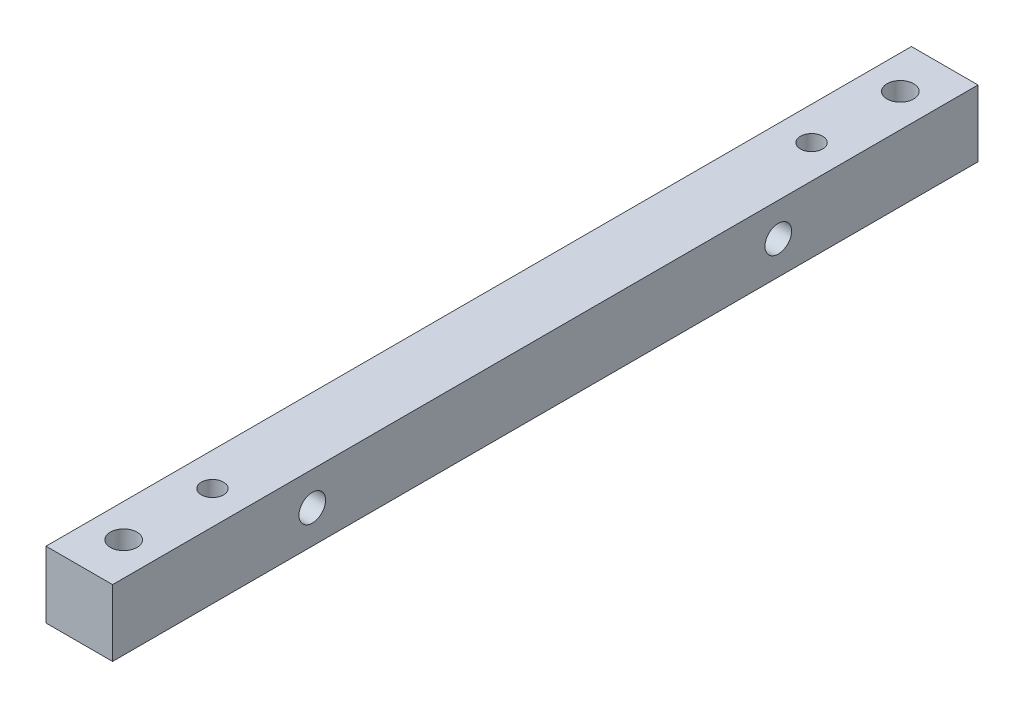
ISO-10303-21;
HEADER;
FILE_DESCRIPTION(('STEP AP214'),'2;1');
FILE_NAME('part.step','',(''),(''),'','','');
FILE_SCHEMA(('AUTOMOTIVE_DESIGN { 1 0 10303 214 1 1 1 1 }'));
ENDSEC;
DATA;
#1=APPLICATION_CONTEXT('core data for automotive mechanical design processes');
#2=APPLICATION_PROTOCOL_DEFINITION('international standard','automotive_design',2000,#1);
#3=PRODUCT_CONTEXT('',#1,'mechanical');
#4=PRODUCT('Part','Part','',(#3));
#5=PRODUCT_RELATED_PRODUCT_CATEGORY('part','',(#4));
#6=PRODUCT_DEFINITION_FORMATION('','',#4);
#7=PRODUCT_DEFINITION_CONTEXT('part definition',#1,'design');
#8=PRODUCT_DEFINITION('design','',#6,#7);
#9=PRODUCT_DEFINITION_SHAPE('','',#8);
#10=(LENGTH_UNIT() NAMED_UNIT(*) SI_UNIT(.MILLI.,.METRE.));
#11=(NAMED_UNIT(*) PLANE_ANGLE_UNIT() SI_UNIT($,.RADIAN.));
#12=(NAMED_UNIT(*) SI_UNIT($,.STERADIAN.) SOLID_ANGLE_UNIT());
#13=UNCERTAINTY_MEASURE_WITH_UNIT(LENGTH_MEASURE(1.E-05),#10,'distance_accuracy_value','');
#14=(GEOMETRIC_REPRESENTATION_CONTEXT(3) GLOBAL_UNCERTAINTY_ASSIGNED_CONTEXT((#13)) GLOBAL_UNIT_ASSIGNED_CONTEXT((#10,
#11,#12)) REPRESENTATION_CONTEXT('',''));
#15=CARTESIAN_POINT('',(0.,0.,0.));
#16=DIRECTION('',(0.,0.,1.));
#17=DIRECTION('',(1.,0.,0.));
#18=AXIS2_PLACEMENT_3D('',#15,#16,#17);
#19=CARTESIAN_POINT('',(0.,0.,78.));
#20=DIRECTION('',(1.,0.,0.));
#21=DIRECTION('',(0.,0.,-1.));
#22=AXIS2_PLACEMENT_3D('',#19,#20,#21);
#23=PLANE('',#22);
#24=CARTESIAN_POINT('',(0.,3.,60.));
#25=DIRECTION('',(1.,0.,0.));
#26=DIRECTION('',(0.,0.,-1.));
#27=AXIS2_PLACEMENT_3D('',#24,#25,#26);
#28=CIRCLE('',#27,1.2);
#29=CARTESIAN_POINT('',(0.,3.,58.8));
#30=VERTEX_POINT('',#29);
#31=EDGE_CURVE('E129',#30,#30,#28,.T.);
#32=ORIENTED_EDGE('',*,*,#31,.T.);
#33=EDGE_LOOP('',(#32));
#34=FACE_BOUND('',#33,.T.);
#35=CARTESIAN_POINT('',(0.,3.,18.));
#36=DIRECTION('',(1.,0.,0.));
#37=DIRECTION('',(0.,0.,-1.));
#38=AXIS2_PLACEMENT_3D('',#35,#36,#37);
#39=CIRCLE('',#38,1.2);
#40=CARTESIAN_POINT('',(0.,3.,16.8));
#41=VERTEX_POINT('',#40);
#42=EDGE_CURVE('E139',#41,#41,#39,.T.);
#43=ORIENTED_EDGE('',*,*,#42,.T.);
#44=EDGE_LOOP('',(#43));
#45=FACE_BOUND('',#44,.T.);
#46=DIRECTION('',(0.,-1.,0.));
#47=VECTOR('',#46,1.);
#48=CARTESIAN_POINT('',(0.,0.,0.));
#49=LINE('',#48,#47);
#50=CARTESIAN_POINT('',(0.,6.,0.));
#51=VERTEX_POINT('',#50);
#52=CARTESIAN_POINT('',(0.,0.,0.));
#53=VERTEX_POINT('',#52);
#54=EDGE_CURVE('E99',#51,#53,#49,.T.);
#55=ORIENTED_EDGE('',*,*,#54,.T.);
#56=DIRECTION('',(0.,0.,-1.));
#57=VECTOR('',#56,1.);
#58=CARTESIAN_POINT('',(0.,0.,78.));
#59=LINE('',#58,#57);
#60=CARTESIAN_POINT('',(0.,0.,78.));
#61=VERTEX_POINT('',#60);
#62=EDGE_CURVE('E11',#61,#53,#59,.T.);
#63=ORIENTED_EDGE('',*,*,#62,.F.);
#64=DIRECTION('',(0.,-1.,0.));
#65=VECTOR('',#64,1.);
#66=CARTESIAN_POINT('',(0.,0.,78.));
#67=LINE('',#66,#65);
#68=CARTESIAN_POINT('',(0.,6.,78.));
#69=VERTEX_POINT('',#68);
#70=EDGE_CURVE('E87',#69,#61,#67,.T.);
#71=ORIENTED_EDGE('',*,*,#70,.F.);
#72=DIRECTION('',(0.,0.,-1.));
#73=VECTOR('',#72,1.);
#74=CARTESIAN_POINT('',(0.,6.,78.));
#75=LINE('',#74,#73);
#76=EDGE_CURVE('E95',#69,#51,#75,.T.);
#77=ORIENTED_EDGE('',*,*,#76,.T.);
#78=EDGE_LOOP('',(#55,#63,#71,#77));
#79=FACE_BOUND('',#78,.T.);
#80=ADVANCED_FACE('F36',(#34,#45,#79),#23,.F.);
#81=CARTESIAN_POINT('',(0.,0.,78.));
#82=DIRECTION('',(0.,1.,0.));
#83=DIRECTION('',(0.,0.,1.));
#84=AXIS2_PLACEMENT_3D('',#81,#82,#83);
#85=PLANE('',#84);
#86=CARTESIAN_POINT('',(3.,0.,74.));
#87=DIRECTION('',(0.,1.,0.));
#88=DIRECTION('',(0.,0.,1.));
#89=AXIS2_PLACEMENT_3D('',#86,#87,#88);
#90=CIRCLE('',#89,1.2);
#91=CARTESIAN_POINT('',(3.,0.,75.2));
#92=VERTEX_POINT('',#91);
#93=EDGE_CURVE('E102',#92,#92,#90,.T.);
#94=ORIENTED_EDGE('',*,*,#93,.T.);
#95=EDGE_LOOP('',(#94));
#96=FACE_BOUND('',#95,.T.);
#97=CARTESIAN_POINT('',(3.,0.,4.));
#98=DIRECTION('',(0.,1.,0.));
#99=DIRECTION('',(0.,0.,1.));
#100=AXIS2_PLACEMENT_3D('',#97,#98,#99);
#101=CIRCLE('',#100,1.2);
#102=CARTESIAN_POINT('',(3.,0.,5.2));
#103=VERTEX_POINT('',#102);
#104=EDGE_CURVE('E115',#103,#103,#101,.T.);
#105=ORIENTED_EDGE('',*,*,#104,.T.);
#106=EDGE_LOOP('',(#105));
#107=FACE_BOUND('',#106,.T.);
#108=CARTESIAN_POINT('',(3.,0.,12.));
#109=DIRECTION('',(0.,1.,0.));
#110=DIRECTION('',(0.,0.,1.));
#111=AXIS2_PLACEMENT_3D('',#108,#109,#110);
#112=CIRCLE('',#111,1.);
#113=CARTESIAN_POINT('',(3.,0.,13.));
#114=VERTEX_POINT('',#113);
#115=EDGE_CURVE('E118',#114,#114,#112,.T.);
#116=ORIENTED_EDGE('',*,*,#115,.T.);
#117=EDGE_LOOP('',(#116));
#118=FACE_BOUND('',#117,.T.);
#119=CARTESIAN_POINT('',(3.,0.,66.));
#120=DIRECTION('',(0.,1.,0.));
#121=DIRECTION('',(0.,0.,1.));
#122=AXIS2_PLACEMENT_3D('',#119,#120,#121);
#123=CIRCLE('',#122,1.);
#124=CARTESIAN_POINT('',(3.,0.,67.));
#125=VERTEX_POINT('',#124);
#126=EDGE_CURVE('E121',#125,#125,#123,.T.);
#127=ORIENTED_EDGE('',*,*,#126,.T.);
#128=EDGE_LOOP('',(#127));
#129=FACE_BOUND('',#128,.T.);
#130=DIRECTION('',(1.,0.,0.));
#131=VECTOR('',#130,1.);
#132=CARTESIAN_POINT('',(0.,0.,0.));
#133=LINE('',#132,#131);
#134=CARTESIAN_POINT('',(6.,0.,0.));
#135=VERTEX_POINT('',#134);
#136=EDGE_CURVE('E91',#53,#135,#133,.T.);
#137=ORIENTED_EDGE('',*,*,#136,.T.);
#138=DIRECTION('',(0.,0.,-1.));
#139=VECTOR('',#138,1.);
#140=CARTESIAN_POINT('',(6.,0.,78.));
#141=LINE('',#140,#139);
#142=CARTESIAN_POINT('',(6.,0.,78.));
#143=VERTEX_POINT('',#142);
#144=EDGE_CURVE('E44',#143,#135,#141,.T.);
#145=ORIENTED_EDGE('',*,*,#144,.F.);
#146=DIRECTION('',(1.,0.,0.));
#147=VECTOR('',#146,1.);
#148=CARTESIAN_POINT('',(0.,0.,78.));
#149=LINE('',#148,#147);
#150=EDGE_CURVE('E82',#61,#143,#149,.T.);
#151=ORIENTED_EDGE('',*,*,#150,.F.);
#152=ORIENTED_EDGE('',*,*,#62,.T.);
#153=EDGE_LOOP('',(#137,#145,#151,#152));
#154=FACE_BOUND('',#153,.T.);
#155=ADVANCED_FACE('F90',(#96,#107,#118,#129,#154),#85,.F.);
#156=CARTESIAN_POINT('',(6.,0.,78.));
#157=DIRECTION('',(-1.,0.,0.));
#158=DIRECTION('',(0.,0.,1.));
#159=AXIS2_PLACEMENT_3D('',#156,#157,#158);
#160=PLANE('',#159);
#161=CARTESIAN_POINT('',(6.,3.,60.));
#162=DIRECTION('',(1.,0.,0.));
#163=DIRECTION('',(0.,0.,-1.));
#164=AXIS2_PLACEMENT_3D('',#161,#162,#163);
#165=CIRCLE('',#164,1.2);
#166=CARTESIAN_POINT('',(6.,3.,58.8));
#167=VERTEX_POINT('',#166);
#168=EDGE_CURVE('E142',#167,#167,#165,.T.);
#169=ORIENTED_EDGE('',*,*,#168,.F.);
#170=EDGE_LOOP('',(#169));
#171=FACE_BOUND('',#170,.T.);
#172=CARTESIAN_POINT('',(6.,3.,18.));
#173=DIRECTION('',(1.,0.,0.));
#174=DIRECTION('',(0.,0.,-1.));
#175=AXIS2_PLACEMENT_3D('',#172,#173,#174);
#176=CIRCLE('',#175,1.2);
#177=CARTESIAN_POINT('',(6.,3.,16.8));
#178=VERTEX_POINT('',#177);
#179=EDGE_CURVE('E143',#178,#178,#176,.T.);
#180=ORIENTED_EDGE('',*,*,#179,.F.);
#181=EDGE_LOOP('',(#180));
#182=FACE_BOUND('',#181,.T.);
#183=DIRECTION('',(0.,1.,0.));
#184=VECTOR('',#183,1.);
#185=CARTESIAN_POINT('',(6.,0.,0.));
#186=LINE('',#185,#184);
#187=CARTESIAN_POINT('',(6.,6.,0.));
#188=VERTEX_POINT('',#187);
#189=EDGE_CURVE('E69',#135,#188,#186,.T.);
#190=ORIENTED_EDGE('',*,*,#189,.T.);
#191=DIRECTION('',(0.,0.,-1.));
#192=VECTOR('',#191,1.);
#193=CARTESIAN_POINT('',(6.,6.,78.));
#194=LINE('',#193,#192);
#195=CARTESIAN_POINT('',(6.,6.,78.));
#196=VERTEX_POINT('',#195);
#197=EDGE_CURVE('E92',#196,#188,#194,.T.);
#198=ORIENTED_EDGE('',*,*,#197,.F.);
#199=DIRECTION('',(0.,1.,0.));
#200=VECTOR('',#199,1.);
#201=CARTESIAN_POINT('',(6.,0.,78.));
#202=LINE('',#201,#200);
#203=EDGE_CURVE('E85',#143,#196,#202,.T.);
#204=ORIENTED_EDGE('',*,*,#203,.F.);
#205=ORIENTED_EDGE('',*,*,#144,.T.);
#206=EDGE_LOOP('',(#190,#198,#204,#205));
#207=FACE_BOUND('',#206,.T.);
#208=ADVANCED_FACE('F93',(#171,#182,#207),#160,.F.);
#209=CARTESIAN_POINT('',(0.,6.,78.));
#210=DIRECTION('',(0.,-1.,0.));
#211=DIRECTION('',(0.,0.,-1.));
#212=AXIS2_PLACEMENT_3D('',#209,#210,#211);
#213=PLANE('',#212);
#214=CARTESIAN_POINT('',(3.,6.,74.));
#215=DIRECTION('',(0.,1.,0.));
#216=DIRECTION('',(0.,0.,1.));
#217=AXIS2_PLACEMENT_3D('',#214,#215,#216);
#218=CIRCLE('',#217,1.2);
#219=CARTESIAN_POINT('',(3.,6.,75.2));
#220=VERTEX_POINT('',#219);
#221=EDGE_CURVE('E124',#220,#220,#218,.T.);
#222=ORIENTED_EDGE('',*,*,#221,.F.);
#223=EDGE_LOOP('',(#222));
#224=FACE_BOUND('',#223,.T.);
#225=CARTESIAN_POINT('',(3.,6.,4.));
#226=DIRECTION('',(0.,1.,0.));
#227=DIRECTION('',(0.,0.,1.));
#228=AXIS2_PLACEMENT_3D('',#225,#226,#227);
#229=CIRCLE('',#228,1.2);
#230=CARTESIAN_POINT('',(3.,6.,5.2));
#231=VERTEX_POINT('',#230);
#232=EDGE_CURVE('E132',#231,#231,#229,.T.);
#233=ORIENTED_EDGE('',*,*,#232,.F.);
#234=EDGE_LOOP('',(#233));
#235=FACE_BOUND('',#234,.T.);
#236=CARTESIAN_POINT('',(3.,6.,12.));
#237=DIRECTION('',(0.,1.,0.));
#238=DIRECTION('',(0.,0.,1.));
#239=AXIS2_PLACEMENT_3D('',#236,#237,#238);
#240=CIRCLE('',#239,1.);
#241=CARTESIAN_POINT('',(3.,6.,13.));
#242=VERTEX_POINT('',#241);
#243=EDGE_CURVE('E128',#242,#242,#240,.T.);
#244=ORIENTED_EDGE('',*,*,#243,.F.);
#245=EDGE_LOOP('',(#244));
#246=FACE_BOUND('',#245,.T.);
#247=CARTESIAN_POINT('',(3.,6.,66.));
#248=DIRECTION('',(0.,1.,0.));
#249=DIRECTION('',(0.,0.,1.));
#250=AXIS2_PLACEMENT_3D('',#247,#248,#249);
#251=CIRCLE('',#250,1.);
#252=CARTESIAN_POINT('',(3.,6.,67.));
#253=VERTEX_POINT('',#252);
#254=EDGE_CURVE('E125',#253,#253,#251,.T.);
#255=ORIENTED_EDGE('',*,*,#254,.F.);
#256=EDGE_LOOP('',(#255));
#257=FACE_BOUND('',#256,.T.);
#258=DIRECTION('',(-1.,0.,0.));
#259=VECTOR('',#258,1.);
#260=CARTESIAN_POINT('',(0.,6.,0.));
#261=LINE('',#260,#259);
#262=EDGE_CURVE('E75',#188,#51,#261,.T.);
#263=ORIENTED_EDGE('',*,*,#262,.T.);
#264=ORIENTED_EDGE('',*,*,#76,.F.);
#265=DIRECTION('',(-1.,0.,0.));
#266=VECTOR('',#265,1.);
#267=CARTESIAN_POINT('',(0.,6.,78.));
#268=LINE('',#267,#266);
#269=EDGE_CURVE('E52',#196,#69,#268,.T.);
#270=ORIENTED_EDGE('',*,*,#269,.F.);
#271=ORIENTED_EDGE('',*,*,#197,.T.);
#272=EDGE_LOOP('',(#263,#264,#270,#271));
#273=FACE_BOUND('',#272,.T.);
#274=ADVANCED_FACE('F107',(#224,#235,#246,#257,#273),#213,.F.);
#275=CARTESIAN_POINT('',(0.,0.,78.));
#276=DIRECTION('',(0.,0.,-1.));
#277=DIRECTION('',(-1.,0.,0.));
#278=AXIS2_PLACEMENT_3D('',#275,#276,#277);
#279=PLANE('',#278);
#280=ORIENTED_EDGE('',*,*,#70,.T.);
#281=ORIENTED_EDGE('',*,*,#150,.T.);
#282=ORIENTED_EDGE('',*,*,#203,.T.);
#283=ORIENTED_EDGE('',*,*,#269,.T.);
#284=EDGE_LOOP('',(#280,#281,#282,#283));
#285=FACE_BOUND('',#284,.T.);
#286=ADVANCED_FACE('F83',(#285),#279,.F.);
#287=CARTESIAN_POINT('',(0.,0.,0.));
#288=DIRECTION('',(0.,0.,-1.));
#289=DIRECTION('',(-1.,0.,0.));
#290=AXIS2_PLACEMENT_3D('',#287,#288,#289);
#291=PLANE('',#290);
#292=ORIENTED_EDGE('',*,*,#54,.F.);
#293=ORIENTED_EDGE('',*,*,#262,.F.);
#294=ORIENTED_EDGE('',*,*,#189,.F.);
#295=ORIENTED_EDGE('',*,*,#136,.F.);
#296=EDGE_LOOP('',(#292,#293,#294,#295));
#297=FACE_BOUND('',#296,.T.);
#298=ADVANCED_FACE('F110',(#297),#291,.T.);
#299=CARTESIAN_POINT('',(3.,-74.,66.));
#300=DIRECTION('',(0.,1.,0.));
#301=DIRECTION('',(0.,0.,1.));
#302=AXIS2_PLACEMENT_3D('',#299,#300,#301);
#303=CYLINDRICAL_SURFACE('',#302,1.);
#304=ORIENTED_EDGE('',*,*,#254,.T.);
#305=EDGE_LOOP('',(#304));
#306=FACE_BOUND('',#305,.T.);
#307=ORIENTED_EDGE('',*,*,#126,.F.);
#308=EDGE_LOOP('',(#307));
#309=FACE_BOUND('',#308,.T.);
#310=ADVANCED_FACE('F186',(#306,#309),#303,.F.);
#311=CARTESIAN_POINT('',(3.,-74.,12.));
#312=DIRECTION('',(0.,1.,0.));
#313=DIRECTION('',(0.,0.,1.));
#314=AXIS2_PLACEMENT_3D('',#311,#312,#313);
#315=CYLINDRICAL_SURFACE('',#314,1.);
#316=ORIENTED_EDGE('',*,*,#243,.T.);
#317=EDGE_LOOP('',(#316));
#318=FACE_BOUND('',#317,.T.);
#319=ORIENTED_EDGE('',*,*,#115,.F.);
#320=EDGE_LOOP('',(#319));
#321=FACE_BOUND('',#320,.T.);
#322=ADVANCED_FACE('F182',(#318,#321),#315,.F.);
#323=CARTESIAN_POINT('',(3.,-74.,4.));
#324=DIRECTION('',(0.,1.,0.));
#325=DIRECTION('',(0.,0.,1.));
#326=AXIS2_PLACEMENT_3D('',#323,#324,#325);
#327=CYLINDRICAL_SURFACE('',#326,1.2);
#328=ORIENTED_EDGE('',*,*,#232,.T.);
#329=EDGE_LOOP('',(#328));
#330=FACE_BOUND('',#329,.T.);
#331=ORIENTED_EDGE('',*,*,#104,.F.);
#332=EDGE_LOOP('',(#331));
#333=FACE_BOUND('',#332,.T.);
#334=ADVANCED_FACE('F178',(#330,#333),#327,.F.);
#335=CARTESIAN_POINT('',(3.,-74.,74.));
#336=DIRECTION('',(0.,1.,0.));
#337=DIRECTION('',(0.,0.,1.));
#338=AXIS2_PLACEMENT_3D('',#335,#336,#337);
#339=CYLINDRICAL_SURFACE('',#338,1.2);
#340=ORIENTED_EDGE('',*,*,#221,.T.);
#341=EDGE_LOOP('',(#340));
#342=FACE_BOUND('',#341,.T.);
#343=ORIENTED_EDGE('',*,*,#93,.F.);
#344=EDGE_LOOP('',(#343));
#345=FACE_BOUND('',#344,.T.);
#346=ADVANCED_FACE('F160',(#342,#345),#339,.F.);
#347=CARTESIAN_POINT('',(-74.,3.,18.));
#348=DIRECTION('',(1.,0.,0.));
#349=DIRECTION('',(0.,0.,-1.));
#350=AXIS2_PLACEMENT_3D('',#347,#348,#349);
#351=CYLINDRICAL_SURFACE('',#350,1.2);
#352=ORIENTED_EDGE('',*,*,#179,.T.);
#353=EDGE_LOOP('',(#352));
#354=FACE_BOUND('',#353,.T.);
#355=ORIENTED_EDGE('',*,*,#42,.F.);
#356=EDGE_LOOP('',(#355));
#357=FACE_BOUND('',#356,.T.);
#358=ADVANCED_FACE('F157',(#354,#357),#351,.F.);
#359=CARTESIAN_POINT('',(-74.,3.,60.));
#360=DIRECTION('',(1.,0.,0.));
#361=DIRECTION('',(0.,0.,-1.));
#362=AXIS2_PLACEMENT_3D('',#359,#360,#361);
#363=CYLINDRICAL_SURFACE('',#362,1.2);
#364=ORIENTED_EDGE('',*,*,#168,.T.);
#365=EDGE_LOOP('',(#364));
#366=FACE_BOUND('',#365,.T.);
#367=ORIENTED_EDGE('',*,*,#31,.F.);
#368=EDGE_LOOP('',(#367));
#369=FACE_BOUND('',#368,.T.);
#370=ADVANCED_FACE('F149',(#366,#369),#363,.F.);
#371=CLOSED_SHELL('',(#80,#155,#208,#274,#286,#298,#310,#322,#334,#346,#358,#370));
#372=MANIFOLD_SOLID_BREP('B2',#371);
#373=ADVANCED_BREP_SHAPE_REPRESENTATION('',(#18,#372),#14);
#374=SHAPE_DEFINITION_REPRESENTATION(#9,#373);
ENDSEC;
END-ISO-10303-21;
